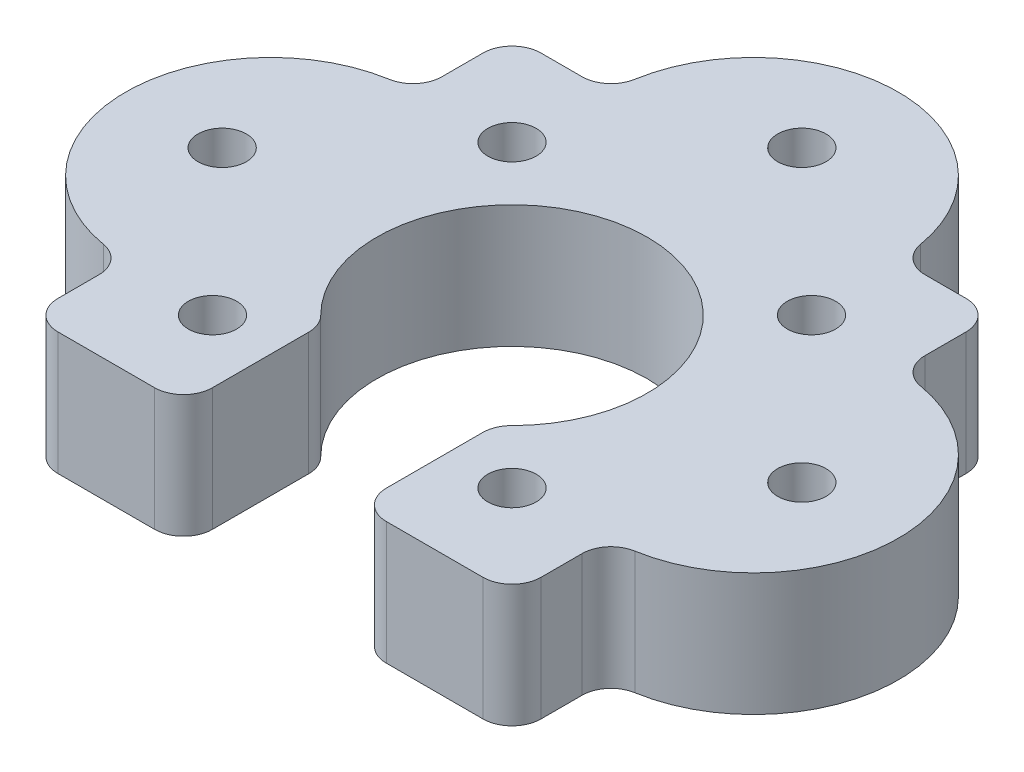
ISO-10303-21;
HEADER;
FILE_DESCRIPTION(('STEP AP214'),'2;1');
FILE_NAME('part.step','',(''),(''),'','','');
FILE_SCHEMA(('AUTOMOTIVE_DESIGN { 1 0 10303 214 1 1 1 1 }'));
ENDSEC;
DATA;
#1=APPLICATION_CONTEXT('core data for automotive mechanical design processes');
#2=APPLICATION_PROTOCOL_DEFINITION('international standard','automotive_design',2000,#1);
#3=PRODUCT_CONTEXT('',#1,'mechanical');
#4=PRODUCT('Part','Part','',(#3));
#5=PRODUCT_RELATED_PRODUCT_CATEGORY('part','',(#4));
#6=PRODUCT_DEFINITION_FORMATION('','',#4);
#7=PRODUCT_DEFINITION_CONTEXT('part definition',#1,'design');
#8=PRODUCT_DEFINITION('design','',#6,#7);
#9=PRODUCT_DEFINITION_SHAPE('','',#8);
#10=(LENGTH_UNIT() NAMED_UNIT(*) SI_UNIT(.MILLI.,.METRE.));
#11=(NAMED_UNIT(*) PLANE_ANGLE_UNIT() SI_UNIT($,.RADIAN.));
#12=(NAMED_UNIT(*) SI_UNIT($,.STERADIAN.) SOLID_ANGLE_UNIT());
#13=UNCERTAINTY_MEASURE_WITH_UNIT(LENGTH_MEASURE(1.E-05),#10,'distance_accuracy_value','');
#14=(GEOMETRIC_REPRESENTATION_CONTEXT(3) GLOBAL_UNCERTAINTY_ASSIGNED_CONTEXT((#13)) GLOBAL_UNIT_ASSIGNED_CONTEXT((#10,
#11,#12)) REPRESENTATION_CONTEXT('',''));
#15=CARTESIAN_POINT('',(0.,0.,0.));
#16=DIRECTION('',(0.,0.,1.));
#17=DIRECTION('',(1.,0.,0.));
#18=AXIS2_PLACEMENT_3D('',#15,#16,#17);
#19=CARTESIAN_POINT('',(-25.,-12.7,0.));
#20=DIRECTION('',(0.,1.,0.));
#21=DIRECTION('',(0.,0.,1.));
#22=AXIS2_PLACEMENT_3D('',#19,#20,#21);
#23=CYLINDRICAL_SURFACE('',#22,15.);
#24=CARTESIAN_POINT('',(-25.,-12.7,0.));
#25=DIRECTION('',(0.,1.,0.));
#26=DIRECTION('',(0.,0.,1.));
#27=AXIS2_PLACEMENT_3D('',#24,#25,#26);
#28=CIRCLE('',#27,15.);
#29=CARTESIAN_POINT('',(-27.5,-12.7,-14.790199457749));
#30=VERTEX_POINT('',#29);
#31=CARTESIAN_POINT('',(-27.5,-12.7,14.790199457749));
#32=VERTEX_POINT('',#31);
#33=EDGE_CURVE('E390',#30,#32,#28,.T.);
#34=ORIENTED_EDGE('',*,*,#33,.T.);
#35=DIRECTION('',(0.,1.,0.));
#36=VECTOR('',#35,1.);
#37=CARTESIAN_POINT('',(-27.5,-12.7,14.790199457749));
#38=LINE('',#37,#36);
#39=CARTESIAN_POINT('',(-27.5,0.,14.790199457749));
#40=VERTEX_POINT('',#39);
#41=EDGE_CURVE('E622',#32,#40,#38,.T.);
#42=ORIENTED_EDGE('',*,*,#41,.T.);
#43=CARTESIAN_POINT('',(-25.,0.,0.));
#44=DIRECTION('',(0.,1.,0.));
#45=DIRECTION('',(0.,0.,1.));
#46=AXIS2_PLACEMENT_3D('',#43,#44,#45);
#47=CIRCLE('',#46,15.);
#48=CARTESIAN_POINT('',(-27.5,0.,-14.790199457749));
#49=VERTEX_POINT('',#48);
#50=EDGE_CURVE('E391',#49,#40,#47,.T.);
#51=ORIENTED_EDGE('',*,*,#50,.F.);
#52=DIRECTION('',(0.,1.,0.));
#53=VECTOR('',#52,1.);
#54=CARTESIAN_POINT('',(-27.5,-12.7,-14.790199457749));
#55=LINE('',#54,#53);
#56=EDGE_CURVE('E620',#49,#30,#55,.F.);
#57=ORIENTED_EDGE('',*,*,#56,.T.);
#58=EDGE_LOOP('',(#34,#42,#51,#57));
#59=FACE_BOUND('',#58,.T.);
#60=ADVANCED_FACE('F43',(#59),#23,.T.);
#61=CARTESIAN_POINT('',(-25.,-12.7,0.));
#62=DIRECTION('',(-1.,0.,0.));
#63=DIRECTION('',(0.,0.,1.));
#64=AXIS2_PLACEMENT_3D('',#61,#62,#63);
#65=PLANE('',#64);
#66=DIRECTION('',(0.,0.,1.));
#67=VECTOR('',#66,1.);
#68=CARTESIAN_POINT('',(-25.,-12.7,0.));
#69=LINE('',#68,#67);
#70=CARTESIAN_POINT('',(-25.,-12.7,-22.));
#71=VERTEX_POINT('',#70);
#72=CARTESIAN_POINT('',(-25.,-12.7,-17.7482393492988));
#73=VERTEX_POINT('',#72);
#74=EDGE_CURVE('E257',#71,#73,#69,.T.);
#75=ORIENTED_EDGE('',*,*,#74,.T.);
#76=DIRECTION('',(0.,-1.,0.));
#77=VECTOR('',#76,1.);
#78=CARTESIAN_POINT('',(-25.,0.,-17.7482393492988));
#79=LINE('',#78,#77);
#80=CARTESIAN_POINT('',(-25.,0.,-17.7482393492988));
#81=VERTEX_POINT('',#80);
#82=EDGE_CURVE('E631',#73,#81,#79,.F.);
#83=ORIENTED_EDGE('',*,*,#82,.T.);
#84=DIRECTION('',(0.,0.,1.));
#85=VECTOR('',#84,1.);
#86=CARTESIAN_POINT('',(-25.,0.,0.));
#87=LINE('',#86,#85);
#88=CARTESIAN_POINT('',(-25.,0.,-22.));
#89=VERTEX_POINT('',#88);
#90=EDGE_CURVE('E385',#89,#81,#87,.T.);
#91=ORIENTED_EDGE('',*,*,#90,.F.);
#92=DIRECTION('',(0.,1.,0.));
#93=VECTOR('',#92,1.);
#94=CARTESIAN_POINT('',(-25.,-12.7,-22.));
#95=LINE('',#94,#93);
#96=EDGE_CURVE('E629',#89,#71,#95,.F.);
#97=ORIENTED_EDGE('',*,*,#96,.T.);
#98=EDGE_LOOP('',(#75,#83,#91,#97));
#99=FACE_BOUND('',#98,.T.);
#100=ADVANCED_FACE('F517',(#99),#65,.T.);
#101=CARTESIAN_POINT('',(0.,-12.7,-25.));
#102=DIRECTION('',(0.,0.,-1.));
#103=DIRECTION('',(-1.,0.,0.));
#104=AXIS2_PLACEMENT_3D('',#101,#102,#103);
#105=PLANE('',#104);
#106=DIRECTION('',(-1.,0.,0.));
#107=VECTOR('',#106,1.);
#108=CARTESIAN_POINT('',(0.,0.,-25.));
#109=LINE('',#108,#107);
#110=CARTESIAN_POINT('',(-17.7482393492989,0.,-25.));
#111=VERTEX_POINT('',#110);
#112=CARTESIAN_POINT('',(-22.,0.,-25.));
#113=VERTEX_POINT('',#112);
#114=EDGE_CURVE('E253',#111,#113,#109,.T.);
#115=ORIENTED_EDGE('',*,*,#114,.F.);
#116=DIRECTION('',(0.,-1.,0.));
#117=VECTOR('',#116,1.);
#118=CARTESIAN_POINT('',(-17.7482393492989,-12.7,-25.));
#119=LINE('',#118,#117);
#120=CARTESIAN_POINT('',(-17.7482393492989,-12.7,-25.));
#121=VERTEX_POINT('',#120);
#122=EDGE_CURVE('E270',#111,#121,#119,.T.);
#123=ORIENTED_EDGE('',*,*,#122,.T.);
#124=DIRECTION('',(-1.,0.,0.));
#125=VECTOR('',#124,1.);
#126=CARTESIAN_POINT('',(0.,-12.7,-25.));
#127=LINE('',#126,#125);
#128=CARTESIAN_POINT('',(-22.,-12.7,-25.));
#129=VERTEX_POINT('',#128);
#130=EDGE_CURVE('E262',#121,#129,#127,.T.);
#131=ORIENTED_EDGE('',*,*,#130,.T.);
#132=DIRECTION('',(0.,1.,0.));
#133=VECTOR('',#132,1.);
#134=CARTESIAN_POINT('',(-22.,-12.7,-25.));
#135=LINE('',#134,#133);
#136=EDGE_CURVE('E259',#129,#113,#135,.T.);
#137=ORIENTED_EDGE('',*,*,#136,.T.);
#138=EDGE_LOOP('',(#115,#123,#131,#137));
#139=FACE_BOUND('',#138,.T.);
#140=ADVANCED_FACE('F523',(#139),#105,.T.);
#141=CARTESIAN_POINT('',(0.,-12.7,-25.));
#142=DIRECTION('',(0.,1.,0.));
#143=DIRECTION('',(0.,0.,1.));
#144=AXIS2_PLACEMENT_3D('',#141,#142,#143);
#145=CYLINDRICAL_SURFACE('',#144,15.);
#146=CARTESIAN_POINT('',(0.,-12.7,-25.));
#147=DIRECTION('',(0.,1.,0.));
#148=DIRECTION('',(0.,0.,1.));
#149=AXIS2_PLACEMENT_3D('',#146,#147,#148);
#150=CIRCLE('',#149,15.);
#151=CARTESIAN_POINT('',(14.790199457749,-12.7,-27.5));
#152=VERTEX_POINT('',#151);
#153=CARTESIAN_POINT('',(-14.790199457749,-12.7,-27.5));
#154=VERTEX_POINT('',#153);
#155=EDGE_CURVE('E398',#152,#154,#150,.T.);
#156=ORIENTED_EDGE('',*,*,#155,.T.);
#157=DIRECTION('',(0.,1.,0.));
#158=VECTOR('',#157,1.);
#159=CARTESIAN_POINT('',(-14.790199457749,-12.7,-27.5));
#160=LINE('',#159,#158);
#161=CARTESIAN_POINT('',(-14.790199457749,0.,-27.5));
#162=VERTEX_POINT('',#161);
#163=EDGE_CURVE('E251',#154,#162,#160,.T.);
#164=ORIENTED_EDGE('',*,*,#163,.T.);
#165=CARTESIAN_POINT('',(0.,0.,-25.));
#166=DIRECTION('',(0.,1.,0.));
#167=DIRECTION('',(0.,0.,1.));
#168=AXIS2_PLACEMENT_3D('',#165,#166,#167);
#169=CIRCLE('',#168,15.);
#170=CARTESIAN_POINT('',(14.790199457749,0.,-27.5));
#171=VERTEX_POINT('',#170);
#172=EDGE_CURVE('E233',#171,#162,#169,.T.);
#173=ORIENTED_EDGE('',*,*,#172,.F.);
#174=DIRECTION('',(0.,1.,0.));
#175=VECTOR('',#174,1.);
#176=CARTESIAN_POINT('',(14.790199457749,-12.7,-27.5));
#177=LINE('',#176,#175);
#178=EDGE_CURVE('E248',#171,#152,#177,.F.);
#179=ORIENTED_EDGE('',*,*,#178,.T.);
#180=EDGE_LOOP('',(#156,#164,#173,#179));
#181=FACE_BOUND('',#180,.T.);
#182=ADVANCED_FACE('F247',(#181),#145,.T.);
#183=CARTESIAN_POINT('',(22.,-12.7,-25.));
#184=VERTEX_POINT('',#183);
#185=CARTESIAN_POINT('',(17.7482393492988,-12.7,-25.));
#186=VERTEX_POINT('',#185);
#187=EDGE_CURVE('E400',#184,#186,#127,.T.);
#188=ORIENTED_EDGE('',*,*,#187,.T.);
#189=DIRECTION('',(0.,-1.,0.));
#190=VECTOR('',#189,1.);
#191=CARTESIAN_POINT('',(17.7482393492988,0.,-25.));
#192=LINE('',#191,#190);
#193=CARTESIAN_POINT('',(17.7482393492988,0.,-25.));
#194=VERTEX_POINT('',#193);
#195=EDGE_CURVE('E274',#186,#194,#192,.F.);
#196=ORIENTED_EDGE('',*,*,#195,.T.);
#197=CARTESIAN_POINT('',(22.,0.,-25.));
#198=VERTEX_POINT('',#197);
#199=EDGE_CURVE('E235',#198,#194,#109,.T.);
#200=ORIENTED_EDGE('',*,*,#199,.F.);
#201=DIRECTION('',(0.,1.,0.));
#202=VECTOR('',#201,1.);
#203=CARTESIAN_POINT('',(22.,-12.7,-25.));
#204=LINE('',#203,#202);
#205=EDGE_CURVE('E272',#198,#184,#204,.F.);
#206=ORIENTED_EDGE('',*,*,#205,.T.);
#207=EDGE_LOOP('',(#188,#196,#200,#206));
#208=FACE_BOUND('',#207,.T.);
#209=ADVANCED_FACE('F676',(#208),#105,.T.);
#210=CARTESIAN_POINT('',(25.,-12.7,0.));
#211=DIRECTION('',(1.,0.,0.));
#212=DIRECTION('',(0.,0.,-1.));
#213=AXIS2_PLACEMENT_3D('',#210,#211,#212);
#214=PLANE('',#213);
#215=DIRECTION('',(0.,0.,-1.));
#216=VECTOR('',#215,1.);
#217=CARTESIAN_POINT('',(25.,0.,0.));
#218=LINE('',#217,#216);
#219=CARTESIAN_POINT('',(25.,0.,-17.7482393492989));
#220=VERTEX_POINT('',#219);
#221=CARTESIAN_POINT('',(25.,0.,-22.));
#222=VERTEX_POINT('',#221);
#223=EDGE_CURVE('E321',#220,#222,#218,.T.);
#224=ORIENTED_EDGE('',*,*,#223,.F.);
#225=DIRECTION('',(0.,-1.,0.));
#226=VECTOR('',#225,1.);
#227=CARTESIAN_POINT('',(25.,-12.7,-17.7482393492989));
#228=LINE('',#227,#226);
#229=CARTESIAN_POINT('',(25.,-12.7,-17.7482393492989));
#230=VERTEX_POINT('',#229);
#231=EDGE_CURVE('E284',#220,#230,#228,.T.);
#232=ORIENTED_EDGE('',*,*,#231,.T.);
#233=DIRECTION('',(0.,0.,-1.));
#234=VECTOR('',#233,1.);
#235=CARTESIAN_POINT('',(25.,-12.7,0.));
#236=LINE('',#235,#234);
#237=CARTESIAN_POINT('',(25.,-12.7,-22.));
#238=VERTEX_POINT('',#237);
#239=EDGE_CURVE('E403',#230,#238,#236,.T.);
#240=ORIENTED_EDGE('',*,*,#239,.T.);
#241=DIRECTION('',(0.,1.,0.));
#242=VECTOR('',#241,1.);
#243=CARTESIAN_POINT('',(25.,-12.7,-22.));
#244=LINE('',#243,#242);
#245=EDGE_CURVE('E281',#238,#222,#244,.T.);
#246=ORIENTED_EDGE('',*,*,#245,.T.);
#247=EDGE_LOOP('',(#224,#232,#240,#246));
#248=FACE_BOUND('',#247,.T.);
#249=ADVANCED_FACE('F684',(#248),#214,.T.);
#250=CARTESIAN_POINT('',(25.,-12.7,0.));
#251=DIRECTION('',(0.,1.,0.));
#252=DIRECTION('',(0.,0.,1.));
#253=AXIS2_PLACEMENT_3D('',#250,#251,#252);
#254=CYLINDRICAL_SURFACE('',#253,15.);
#255=CARTESIAN_POINT('',(25.,-12.7,0.));
#256=DIRECTION('',(0.,1.,0.));
#257=DIRECTION('',(0.,0.,1.));
#258=AXIS2_PLACEMENT_3D('',#255,#256,#257);
#259=CIRCLE('',#258,15.);
#260=CARTESIAN_POINT('',(27.5,-12.7,14.790199457749));
#261=VERTEX_POINT('',#260);
#262=CARTESIAN_POINT('',(27.5,-12.7,-14.7901994577491));
#263=VERTEX_POINT('',#262);
#264=EDGE_CURVE('E404',#261,#263,#259,.T.);
#265=ORIENTED_EDGE('',*,*,#264,.T.);
#266=DIRECTION('',(0.,1.,0.));
#267=VECTOR('',#266,1.);
#268=CARTESIAN_POINT('',(27.5,-12.7,-14.7901994577491));
#269=LINE('',#268,#267);
#270=CARTESIAN_POINT('',(27.5,0.,-14.7901994577491));
#271=VERTEX_POINT('',#270);
#272=EDGE_CURVE('E278',#263,#271,#269,.T.);
#273=ORIENTED_EDGE('',*,*,#272,.T.);
#274=CARTESIAN_POINT('',(25.,0.,0.));
#275=DIRECTION('',(0.,1.,0.));
#276=DIRECTION('',(0.,0.,1.));
#277=AXIS2_PLACEMENT_3D('',#274,#275,#276);
#278=CIRCLE('',#277,15.);
#279=CARTESIAN_POINT('',(27.5,0.,14.790199457749));
#280=VERTEX_POINT('',#279);
#281=EDGE_CURVE('E319',#280,#271,#278,.T.);
#282=ORIENTED_EDGE('',*,*,#281,.F.);
#283=DIRECTION('',(0.,1.,0.));
#284=VECTOR('',#283,1.);
#285=CARTESIAN_POINT('',(27.5,-12.7,14.790199457749));
#286=LINE('',#285,#284);
#287=EDGE_CURVE('E276',#280,#261,#286,.F.);
#288=ORIENTED_EDGE('',*,*,#287,.T.);
#289=EDGE_LOOP('',(#265,#273,#282,#288));
#290=FACE_BOUND('',#289,.T.);
#291=ADVANCED_FACE('F691',(#290),#254,.T.);
#292=CARTESIAN_POINT('',(25.,-12.7,22.));
#293=VERTEX_POINT('',#292);
#294=CARTESIAN_POINT('',(25.,-12.7,17.7482393492988));
#295=VERTEX_POINT('',#294);
#296=EDGE_CURVE('E407',#293,#295,#236,.T.);
#297=ORIENTED_EDGE('',*,*,#296,.T.);
#298=DIRECTION('',(0.,-1.,0.));
#299=VECTOR('',#298,1.);
#300=CARTESIAN_POINT('',(25.,0.,17.7482393492988));
#301=LINE('',#300,#299);
#302=CARTESIAN_POINT('',(25.,0.,17.7482393492988));
#303=VERTEX_POINT('',#302);
#304=EDGE_CURVE('E288',#295,#303,#301,.F.);
#305=ORIENTED_EDGE('',*,*,#304,.T.);
#306=CARTESIAN_POINT('',(25.,0.,22.));
#307=VERTEX_POINT('',#306);
#308=EDGE_CURVE('E315',#307,#303,#218,.T.);
#309=ORIENTED_EDGE('',*,*,#308,.F.);
#310=DIRECTION('',(0.,1.,0.));
#311=VECTOR('',#310,1.);
#312=CARTESIAN_POINT('',(25.,-12.7,22.));
#313=LINE('',#312,#311);
#314=EDGE_CURVE('E286',#307,#293,#313,.F.);
#315=ORIENTED_EDGE('',*,*,#314,.T.);
#316=EDGE_LOOP('',(#297,#305,#309,#315));
#317=FACE_BOUND('',#316,.T.);
#318=ADVANCED_FACE('F697',(#317),#214,.T.);
#319=CARTESIAN_POINT('',(0.,-12.7,25.));
#320=DIRECTION('',(0.,0.,1.));
#321=DIRECTION('',(1.,0.,0.));
#322=AXIS2_PLACEMENT_3D('',#319,#320,#321);
#323=PLANE('',#322);
#324=DIRECTION('',(1.,0.,0.));
#325=VECTOR('',#324,1.);
#326=CARTESIAN_POINT('',(0.,0.,25.));
#327=LINE('',#326,#325);
#328=CARTESIAN_POINT('',(12.,0.,25.));
#329=VERTEX_POINT('',#328);
#330=CARTESIAN_POINT('',(22.,0.,25.));
#331=VERTEX_POINT('',#330);
#332=EDGE_CURVE('E320',#329,#331,#327,.T.);
#333=ORIENTED_EDGE('',*,*,#332,.F.);
#334=DIRECTION('',(0.,1.,0.));
#335=VECTOR('',#334,1.);
#336=CARTESIAN_POINT('',(12.,-12.7,25.));
#337=LINE('',#336,#335);
#338=CARTESIAN_POINT('',(12.,-12.7,25.));
#339=VERTEX_POINT('',#338);
#340=EDGE_CURVE('E613',#329,#339,#337,.F.);
#341=ORIENTED_EDGE('',*,*,#340,.T.);
#342=DIRECTION('',(1.,0.,0.));
#343=VECTOR('',#342,1.);
#344=CARTESIAN_POINT('',(0.,-12.7,25.));
#345=LINE('',#344,#343);
#346=CARTESIAN_POINT('',(22.,-12.7,25.));
#347=VERTEX_POINT('',#346);
#348=EDGE_CURVE('E410',#339,#347,#345,.T.);
#349=ORIENTED_EDGE('',*,*,#348,.T.);
#350=DIRECTION('',(0.,1.,0.));
#351=VECTOR('',#350,1.);
#352=CARTESIAN_POINT('',(22.,-12.7,25.));
#353=LINE('',#352,#351);
#354=EDGE_CURVE('E588',#347,#331,#353,.T.);
#355=ORIENTED_EDGE('',*,*,#354,.T.);
#356=EDGE_LOOP('',(#333,#341,#349,#355));
#357=FACE_BOUND('',#356,.T.);
#358=ADVANCED_FACE('F702',(#357),#323,.T.);
#359=CARTESIAN_POINT('',(8.99999999999999,-12.7,0.));
#360=DIRECTION('',(-1.,0.,0.));
#361=DIRECTION('',(0.,0.,1.));
#362=AXIS2_PLACEMENT_3D('',#359,#360,#361);
#363=PLANE('',#362);
#364=DIRECTION('',(0.,0.,1.));
#365=VECTOR('',#364,1.);
#366=CARTESIAN_POINT('',(8.99999999999999,-12.7,0.));
#367=LINE('',#366,#365);
#368=CARTESIAN_POINT('',(9.,-12.7,12.0415945787923));
#369=VERTEX_POINT('',#368);
#370=CARTESIAN_POINT('',(9.,-12.7,22.));
#371=VERTEX_POINT('',#370);
#372=EDGE_CURVE('E413',#369,#371,#367,.T.);
#373=ORIENTED_EDGE('',*,*,#372,.T.);
#374=DIRECTION('',(0.,1.,0.));
#375=VECTOR('',#374,1.);
#376=CARTESIAN_POINT('',(9.,-12.7,22.));
#377=LINE('',#376,#375);
#378=CARTESIAN_POINT('',(9.,0.,22.));
#379=VERTEX_POINT('',#378);
#380=EDGE_CURVE('E609',#371,#379,#377,.T.);
#381=ORIENTED_EDGE('',*,*,#380,.T.);
#382=DIRECTION('',(0.,0.,1.));
#383=VECTOR('',#382,1.);
#384=CARTESIAN_POINT('',(8.99999999999999,0.,0.));
#385=LINE('',#384,#383);
#386=CARTESIAN_POINT('',(9.,0.,12.0415945787923));
#387=VERTEX_POINT('',#386);
#388=EDGE_CURVE('E360',#387,#379,#385,.T.);
#389=ORIENTED_EDGE('',*,*,#388,.F.);
#390=DIRECTION('',(0.,-1.,0.));
#391=VECTOR('',#390,1.);
#392=CARTESIAN_POINT('',(9.,-12.7,12.0415945787923));
#393=LINE('',#392,#391);
#394=EDGE_CURVE('E607',#387,#369,#393,.T.);
#395=ORIENTED_EDGE('',*,*,#394,.T.);
#396=EDGE_LOOP('',(#373,#381,#389,#395));
#397=FACE_BOUND('',#396,.T.);
#398=ADVANCED_FACE('F709',(#397),#363,.T.);
#399=CARTESIAN_POINT('',(0.,-12.7,0.));
#400=DIRECTION('',(0.,1.,0.));
#401=DIRECTION('',(0.,0.,1.));
#402=AXIS2_PLACEMENT_3D('',#399,#400,#401);
#403=CYLINDRICAL_SURFACE('',#402,14.);
#404=CARTESIAN_POINT('',(0.,-12.7,0.));
#405=DIRECTION('',(0.,1.,0.));
#406=DIRECTION('',(0.,0.,1.));
#407=AXIS2_PLACEMENT_3D('',#404,#405,#406);
#408=CIRCLE('',#407,14.);
#409=CARTESIAN_POINT('',(9.88235294117647,-12.7,9.91660730018189));
#410=VERTEX_POINT('',#409);
#411=CARTESIAN_POINT('',(-9.88235294117647,-12.7,9.91660730018189));
#412=VERTEX_POINT('',#411);
#413=EDGE_CURVE('E416',#410,#412,#408,.T.);
#414=ORIENTED_EDGE('',*,*,#413,.F.);
#415=DIRECTION('',(0.,1.,0.));
#416=VECTOR('',#415,1.);
#417=CARTESIAN_POINT('',(9.88235294117647,-12.7,9.91660730018189));
#418=LINE('',#417,#416);
#419=CARTESIAN_POINT('',(9.88235294117647,0.,9.91660730018189));
#420=VERTEX_POINT('',#419);
#421=EDGE_CURVE('E617',#410,#420,#418,.T.);
#422=ORIENTED_EDGE('',*,*,#421,.T.);
#423=CARTESIAN_POINT('',(0.,0.,0.));
#424=DIRECTION('',(0.,1.,0.));
#425=DIRECTION('',(0.,0.,1.));
#426=AXIS2_PLACEMENT_3D('',#423,#424,#425);
#427=CIRCLE('',#426,14.);
#428=CARTESIAN_POINT('',(-9.88235294117647,0.,9.91660730018189));
#429=VERTEX_POINT('',#428);
#430=EDGE_CURVE('E356',#420,#429,#427,.T.);
#431=ORIENTED_EDGE('',*,*,#430,.T.);
#432=DIRECTION('',(0.,1.,0.));
#433=VECTOR('',#432,1.);
#434=CARTESIAN_POINT('',(-9.88235294117647,-12.7,9.91660730018189));
#435=LINE('',#434,#433);
#436=EDGE_CURVE('E615',#429,#412,#435,.F.);
#437=ORIENTED_EDGE('',*,*,#436,.T.);
#438=EDGE_LOOP('',(#414,#422,#431,#437));
#439=FACE_BOUND('',#438,.T.);
#440=ADVANCED_FACE('F755',(#439),#403,.F.);
#441=CARTESIAN_POINT('',(-8.99999999999999,-12.7,0.));
#442=DIRECTION('',(1.,0.,0.));
#443=DIRECTION('',(0.,0.,-1.));
#444=AXIS2_PLACEMENT_3D('',#441,#442,#443);
#445=PLANE('',#444);
#446=DIRECTION('',(0.,0.,-1.));
#447=VECTOR('',#446,1.);
#448=CARTESIAN_POINT('',(-8.99999999999999,0.,0.));
#449=LINE('',#448,#447);
#450=CARTESIAN_POINT('',(-9.,0.,22.));
#451=VERTEX_POINT('',#450);
#452=CARTESIAN_POINT('',(-9.,0.,12.0415945787923));
#453=VERTEX_POINT('',#452);
#454=EDGE_CURVE('E361',#451,#453,#449,.T.);
#455=ORIENTED_EDGE('',*,*,#454,.F.);
#456=DIRECTION('',(0.,1.,0.));
#457=VECTOR('',#456,1.);
#458=CARTESIAN_POINT('',(-9.,-12.7,22.));
#459=LINE('',#458,#457);
#460=CARTESIAN_POINT('',(-9.,-12.7,22.));
#461=VERTEX_POINT('',#460);
#462=EDGE_CURVE('E595',#451,#461,#459,.F.);
#463=ORIENTED_EDGE('',*,*,#462,.T.);
#464=DIRECTION('',(0.,0.,-1.));
#465=VECTOR('',#464,1.);
#466=CARTESIAN_POINT('',(-8.99999999999999,-12.7,0.));
#467=LINE('',#466,#465);
#468=CARTESIAN_POINT('',(-9.,-12.7,12.0415945787923));
#469=VERTEX_POINT('',#468);
#470=EDGE_CURVE('E419',#461,#469,#467,.T.);
#471=ORIENTED_EDGE('',*,*,#470,.T.);
#472=DIRECTION('',(0.,-1.,0.));
#473=VECTOR('',#472,1.);
#474=CARTESIAN_POINT('',(-9.,0.,12.0415945787923));
#475=LINE('',#474,#473);
#476=EDGE_CURVE('E375',#469,#453,#475,.F.);
#477=ORIENTED_EDGE('',*,*,#476,.T.);
#478=EDGE_LOOP('',(#455,#463,#471,#477));
#479=FACE_BOUND('',#478,.T.);
#480=ADVANCED_FACE('F725',(#479),#445,.T.);
#481=CARTESIAN_POINT('',(0.,-12.7,25.));
#482=DIRECTION('',(0.,0.,1.));
#483=DIRECTION('',(1.,0.,0.));
#484=AXIS2_PLACEMENT_3D('',#481,#482,#483);
#485=PLANE('',#484);
#486=DIRECTION('',(1.,0.,0.));
#487=VECTOR('',#486,1.);
#488=CARTESIAN_POINT('',(0.,-12.7,25.));
#489=LINE('',#488,#487);
#490=CARTESIAN_POINT('',(-22.,-12.7,25.));
#491=VERTEX_POINT('',#490);
#492=CARTESIAN_POINT('',(-12.,-12.7,25.));
#493=VERTEX_POINT('',#492);
#494=EDGE_CURVE('E422',#491,#493,#489,.T.);
#495=ORIENTED_EDGE('',*,*,#494,.T.);
#496=DIRECTION('',(0.,1.,0.));
#497=VECTOR('',#496,1.);
#498=CARTESIAN_POINT('',(-12.,-12.7,25.));
#499=LINE('',#498,#497);
#500=CARTESIAN_POINT('',(-12.,0.,25.));
#501=VERTEX_POINT('',#500);
#502=EDGE_CURVE('E293',#493,#501,#499,.T.);
#503=ORIENTED_EDGE('',*,*,#502,.T.);
#504=DIRECTION('',(1.,0.,0.));
#505=VECTOR('',#504,1.);
#506=CARTESIAN_POINT('',(0.,0.,25.));
#507=LINE('',#506,#505);
#508=CARTESIAN_POINT('',(-22.,0.,25.));
#509=VERTEX_POINT('',#508);
#510=EDGE_CURVE('E381',#509,#501,#507,.T.);
#511=ORIENTED_EDGE('',*,*,#510,.F.);
#512=DIRECTION('',(0.,1.,0.));
#513=VECTOR('',#512,1.);
#514=CARTESIAN_POINT('',(-22.,-12.7,25.));
#515=LINE('',#514,#513);
#516=EDGE_CURVE('E291',#509,#491,#515,.F.);
#517=ORIENTED_EDGE('',*,*,#516,.T.);
#518=EDGE_LOOP('',(#495,#503,#511,#517));
#519=FACE_BOUND('',#518,.T.);
#520=ADVANCED_FACE('F529',(#519),#485,.T.);
#521=CARTESIAN_POINT('',(-25.,0.,17.7482393492988));
#522=VERTEX_POINT('',#521);
#523=CARTESIAN_POINT('',(-25.,0.,22.));
#524=VERTEX_POINT('',#523);
#525=EDGE_CURVE('E384',#522,#524,#87,.T.);
#526=ORIENTED_EDGE('',*,*,#525,.F.);
#527=DIRECTION('',(0.,-1.,0.));
#528=VECTOR('',#527,1.);
#529=CARTESIAN_POINT('',(-25.,-12.7,17.7482393492988));
#530=LINE('',#529,#528);
#531=CARTESIAN_POINT('',(-25.,-12.7,17.7482393492988));
#532=VERTEX_POINT('',#531);
#533=EDGE_CURVE('E65',#522,#532,#530,.T.);
#534=ORIENTED_EDGE('',*,*,#533,.T.);
#535=CARTESIAN_POINT('',(-25.,-12.7,22.));
#536=VERTEX_POINT('',#535);
#537=EDGE_CURVE('E264',#532,#536,#69,.T.);
#538=ORIENTED_EDGE('',*,*,#537,.T.);
#539=DIRECTION('',(0.,1.,0.));
#540=VECTOR('',#539,1.);
#541=CARTESIAN_POINT('',(-25.,-12.7,22.));
#542=LINE('',#541,#540);
#543=EDGE_CURVE('E625',#536,#524,#542,.T.);
#544=ORIENTED_EDGE('',*,*,#543,.T.);
#545=EDGE_LOOP('',(#526,#534,#538,#544));
#546=FACE_BOUND('',#545,.T.);
#547=ADVANCED_FACE('F526',(#546),#65,.T.);
#548=CARTESIAN_POINT('',(0.,-12.7,0.));
#549=DIRECTION('',(0.,1.,0.));
#550=DIRECTION('',(0.,0.,1.));
#551=AXIS2_PLACEMENT_3D('',#548,#549,#550);
#552=PLANE('',#551);
#553=CARTESIAN_POINT('',(-15.5,-12.7,15.5));
#554=DIRECTION('',(0.,1.,0.));
#555=DIRECTION('',(0.,0.,1.));
#556=AXIS2_PLACEMENT_3D('',#553,#554,#555);
#557=CIRCLE('',#556,2.5);
#558=CARTESIAN_POINT('',(-15.5,-12.7,18.));
#559=VERTEX_POINT('',#558);
#560=EDGE_CURVE('E477',#559,#559,#557,.T.);
#561=ORIENTED_EDGE('',*,*,#560,.T.);
#562=EDGE_LOOP('',(#561));
#563=FACE_BOUND('',#562,.T.);
#564=CARTESIAN_POINT('',(-15.5,-12.7,-15.5));
#565=DIRECTION('',(0.,1.,0.));
#566=DIRECTION('',(0.,0.,1.));
#567=AXIS2_PLACEMENT_3D('',#564,#565,#566);
#568=CIRCLE('',#567,2.5);
#569=CARTESIAN_POINT('',(-15.5,-12.7,-13.));
#570=VERTEX_POINT('',#569);
#571=EDGE_CURVE('E467',#570,#570,#568,.T.);
#572=ORIENTED_EDGE('',*,*,#571,.T.);
#573=EDGE_LOOP('',(#572));
#574=FACE_BOUND('',#573,.T.);
#575=CARTESIAN_POINT('',(15.5,-12.7,-15.5));
#576=DIRECTION('',(0.,1.,0.));
#577=DIRECTION('',(0.,0.,1.));
#578=AXIS2_PLACEMENT_3D('',#575,#576,#577);
#579=CIRCLE('',#578,2.5);
#580=CARTESIAN_POINT('',(15.5,-12.7,-13.));
#581=VERTEX_POINT('',#580);
#582=EDGE_CURVE('E459',#581,#581,#579,.T.);
#583=ORIENTED_EDGE('',*,*,#582,.T.);
#584=EDGE_LOOP('',(#583));
#585=FACE_BOUND('',#584,.T.);
#586=CARTESIAN_POINT('',(15.5,-12.7,15.5));
#587=DIRECTION('',(0.,1.,0.));
#588=DIRECTION('',(0.,0.,1.));
#589=AXIS2_PLACEMENT_3D('',#586,#587,#588);
#590=CIRCLE('',#589,2.5);
#591=CARTESIAN_POINT('',(15.5,-12.7,18.));
#592=VERTEX_POINT('',#591);
#593=EDGE_CURVE('E452',#592,#592,#590,.T.);
#594=ORIENTED_EDGE('',*,*,#593,.T.);
#595=EDGE_LOOP('',(#594));
#596=FACE_BOUND('',#595,.T.);
#597=CARTESIAN_POINT('',(-30.,-12.7,0.));
#598=DIRECTION('',(0.,1.,0.));
#599=DIRECTION('',(0.,0.,1.));
#600=AXIS2_PLACEMENT_3D('',#597,#598,#599);
#601=CIRCLE('',#600,2.5);
#602=CARTESIAN_POINT('',(-30.,-12.7,2.5));
#603=VERTEX_POINT('',#602);
#604=EDGE_CURVE('E441',#603,#603,#601,.T.);
#605=ORIENTED_EDGE('',*,*,#604,.T.);
#606=EDGE_LOOP('',(#605));
#607=FACE_BOUND('',#606,.T.);
#608=CARTESIAN_POINT('',(0.,-12.7,-30.));
#609=DIRECTION('',(0.,1.,0.));
#610=DIRECTION('',(0.,0.,1.));
#611=AXIS2_PLACEMENT_3D('',#608,#609,#610);
#612=CIRCLE('',#611,2.5);
#613=CARTESIAN_POINT('',(0.,-12.7,-27.5));
#614=VERTEX_POINT('',#613);
#615=EDGE_CURVE('E433',#614,#614,#612,.T.);
#616=ORIENTED_EDGE('',*,*,#615,.T.);
#617=EDGE_LOOP('',(#616));
#618=FACE_BOUND('',#617,.T.);
#619=CARTESIAN_POINT('',(30.,-12.7,0.));
#620=DIRECTION('',(0.,1.,0.));
#621=DIRECTION('',(0.,0.,1.));
#622=AXIS2_PLACEMENT_3D('',#619,#620,#621);
#623=CIRCLE('',#622,2.5);
#624=CARTESIAN_POINT('',(30.,-12.7,2.49999999999998));
#625=VERTEX_POINT('',#624);
#626=EDGE_CURVE('E397',#625,#625,#623,.T.);
#627=ORIENTED_EDGE('',*,*,#626,.T.);
#628=EDGE_LOOP('',(#627));
#629=FACE_BOUND('',#628,.T.);
#630=ORIENTED_EDGE('',*,*,#470,.F.);
#631=CARTESIAN_POINT('',(-12.,-12.7,22.));
#632=DIRECTION('',(0.,1.,0.));
#633=DIRECTION('',(0.,0.,1.));
#634=AXIS2_PLACEMENT_3D('',#631,#632,#633);
#635=CIRCLE('',#634,3.);
#636=EDGE_CURVE('E605',#461,#493,#635,.F.);
#637=ORIENTED_EDGE('',*,*,#636,.T.);
#638=ORIENTED_EDGE('',*,*,#494,.F.);
#639=CARTESIAN_POINT('',(-22.,-12.7,22.));
#640=DIRECTION('',(0.,1.,0.));
#641=DIRECTION('',(0.,0.,1.));
#642=AXIS2_PLACEMENT_3D('',#639,#640,#641);
#643=CIRCLE('',#642,3.);
#644=EDGE_CURVE('E58',#491,#536,#643,.F.);
#645=ORIENTED_EDGE('',*,*,#644,.T.);
#646=ORIENTED_EDGE('',*,*,#537,.F.);
#647=CARTESIAN_POINT('',(-28.,-12.7,17.7482393492988));
#648=DIRECTION('',(0.,1.,0.));
#649=DIRECTION('',(0.,0.,1.));
#650=AXIS2_PLACEMENT_3D('',#647,#648,#649);
#651=CIRCLE('',#650,3.);
#652=EDGE_CURVE('E652',#532,#32,#651,.T.);
#653=ORIENTED_EDGE('',*,*,#652,.T.);
#654=ORIENTED_EDGE('',*,*,#33,.F.);
#655=CARTESIAN_POINT('',(-28.,-12.7,-17.7482393492988));
#656=DIRECTION('',(0.,1.,0.));
#657=DIRECTION('',(0.,0.,1.));
#658=AXIS2_PLACEMENT_3D('',#655,#656,#657);
#659=CIRCLE('',#658,3.);
#660=EDGE_CURVE('E12',#30,#73,#659,.T.);
#661=ORIENTED_EDGE('',*,*,#660,.T.);
#662=ORIENTED_EDGE('',*,*,#74,.F.);
#663=CARTESIAN_POINT('',(-22.,-12.7,-22.));
#664=DIRECTION('',(0.,1.,0.));
#665=DIRECTION('',(0.,0.,1.));
#666=AXIS2_PLACEMENT_3D('',#663,#664,#665);
#667=CIRCLE('',#666,3.);
#668=EDGE_CURVE('E593',#71,#129,#667,.F.);
#669=ORIENTED_EDGE('',*,*,#668,.T.);
#670=ORIENTED_EDGE('',*,*,#130,.F.);
#671=CARTESIAN_POINT('',(-17.7482393492989,-12.7,-28.));
#672=DIRECTION('',(0.,1.,0.));
#673=DIRECTION('',(0.,0.,1.));
#674=AXIS2_PLACEMENT_3D('',#671,#672,#673);
#675=CIRCLE('',#674,3.);
#676=EDGE_CURVE('E242',#121,#154,#675,.T.);
#677=ORIENTED_EDGE('',*,*,#676,.T.);
#678=ORIENTED_EDGE('',*,*,#155,.F.);
#679=CARTESIAN_POINT('',(17.7482393492988,-12.7,-28.));
#680=DIRECTION('',(0.,1.,0.));
#681=DIRECTION('',(0.,0.,1.));
#682=AXIS2_PLACEMENT_3D('',#679,#680,#681);
#683=CIRCLE('',#682,3.);
#684=EDGE_CURVE('E241',#152,#186,#683,.T.);
#685=ORIENTED_EDGE('',*,*,#684,.T.);
#686=ORIENTED_EDGE('',*,*,#187,.F.);
#687=CARTESIAN_POINT('',(22.,-12.7,-22.));
#688=DIRECTION('',(0.,1.,0.));
#689=DIRECTION('',(0.,0.,1.));
#690=AXIS2_PLACEMENT_3D('',#687,#688,#689);
#691=CIRCLE('',#690,3.);
#692=EDGE_CURVE('E591',#184,#238,#691,.F.);
#693=ORIENTED_EDGE('',*,*,#692,.T.);
#694=ORIENTED_EDGE('',*,*,#239,.F.);
#695=CARTESIAN_POINT('',(28.,-12.7,-17.7482393492989));
#696=DIRECTION('',(0.,1.,0.));
#697=DIRECTION('',(0.,0.,1.));
#698=AXIS2_PLACEMENT_3D('',#695,#696,#697);
#699=CIRCLE('',#698,3.);
#700=EDGE_CURVE('E642',#230,#263,#699,.T.);
#701=ORIENTED_EDGE('',*,*,#700,.T.);
#702=ORIENTED_EDGE('',*,*,#264,.F.);
#703=CARTESIAN_POINT('',(28.,-12.7,17.7482393492988));
#704=DIRECTION('',(0.,1.,0.));
#705=DIRECTION('',(0.,0.,1.));
#706=AXIS2_PLACEMENT_3D('',#703,#704,#705);
#707=CIRCLE('',#706,3.);
#708=EDGE_CURVE('E647',#261,#295,#707,.T.);
#709=ORIENTED_EDGE('',*,*,#708,.T.);
#710=ORIENTED_EDGE('',*,*,#296,.F.);
#711=CARTESIAN_POINT('',(22.,-12.7,22.));
#712=DIRECTION('',(0.,1.,0.));
#713=DIRECTION('',(0.,0.,1.));
#714=AXIS2_PLACEMENT_3D('',#711,#712,#713);
#715=CIRCLE('',#714,3.);
#716=EDGE_CURVE('E586',#293,#347,#715,.F.);
#717=ORIENTED_EDGE('',*,*,#716,.T.);
#718=ORIENTED_EDGE('',*,*,#348,.F.);
#719=CARTESIAN_POINT('',(12.,-12.7,22.));
#720=DIRECTION('',(0.,1.,0.));
#721=DIRECTION('',(0.,0.,1.));
#722=AXIS2_PLACEMENT_3D('',#719,#720,#721);
#723=CIRCLE('',#722,3.);
#724=EDGE_CURVE('E603',#339,#371,#723,.F.);
#725=ORIENTED_EDGE('',*,*,#724,.T.);
#726=ORIENTED_EDGE('',*,*,#372,.F.);
#727=CARTESIAN_POINT('',(12.,-12.7,12.0415945787923));
#728=DIRECTION('',(0.,1.,0.));
#729=DIRECTION('',(0.,0.,1.));
#730=AXIS2_PLACEMENT_3D('',#727,#728,#729);
#731=CIRCLE('',#730,3.);
#732=EDGE_CURVE('E601',#369,#410,#731,.F.);
#733=ORIENTED_EDGE('',*,*,#732,.T.);
#734=ORIENTED_EDGE('',*,*,#413,.T.);
#735=CARTESIAN_POINT('',(-12.,-12.7,12.0415945787923));
#736=DIRECTION('',(0.,1.,0.));
#737=DIRECTION('',(0.,0.,1.));
#738=AXIS2_PLACEMENT_3D('',#735,#736,#737);
#739=CIRCLE('',#738,3.);
#740=EDGE_CURVE('E599',#412,#469,#739,.F.);
#741=ORIENTED_EDGE('',*,*,#740,.T.);
#742=EDGE_LOOP('',(#630,#637,#638,#645,#646,#653,#654,#661,#662,#669,#670,#677,#678,#685,#686,
#693,#694,#701,#702,#709,#710,#717,#718,#725,#726,#733,#734,#741));
#743=FACE_BOUND('',#742,.T.);
#744=ADVANCED_FACE('F490',(#563,#574,#585,#596,#607,#618,#629,#743),#552,.F.);
#745=CARTESIAN_POINT('',(0.,0.,0.));
#746=DIRECTION('',(0.,1.,0.));
#747=DIRECTION('',(0.,0.,1.));
#748=AXIS2_PLACEMENT_3D('',#745,#746,#747);
#749=PLANE('',#748);
#750=CARTESIAN_POINT('',(-15.5,0.,15.5));
#751=DIRECTION('',(0.,1.,0.));
#752=DIRECTION('',(0.,0.,1.));
#753=AXIS2_PLACEMENT_3D('',#750,#751,#752);
#754=CIRCLE('',#753,2.5);
#755=CARTESIAN_POINT('',(-15.5,0.,18.));
#756=VERTEX_POINT('',#755);
#757=EDGE_CURVE('E479',#756,#756,#754,.T.);
#758=ORIENTED_EDGE('',*,*,#757,.F.);
#759=EDGE_LOOP('',(#758));
#760=FACE_BOUND('',#759,.T.);
#761=CARTESIAN_POINT('',(-15.5,0.,-15.5));
#762=DIRECTION('',(0.,1.,0.));
#763=DIRECTION('',(0.,0.,1.));
#764=AXIS2_PLACEMENT_3D('',#761,#762,#763);
#765=CIRCLE('',#764,2.5);
#766=CARTESIAN_POINT('',(-15.5,0.,-13.));
#767=VERTEX_POINT('',#766);
#768=EDGE_CURVE('E472',#767,#767,#765,.T.);
#769=ORIENTED_EDGE('',*,*,#768,.F.);
#770=EDGE_LOOP('',(#769));
#771=FACE_BOUND('',#770,.T.);
#772=CARTESIAN_POINT('',(15.5,0.,-15.5));
#773=DIRECTION('',(0.,1.,0.));
#774=DIRECTION('',(0.,0.,1.));
#775=AXIS2_PLACEMENT_3D('',#772,#773,#774);
#776=CIRCLE('',#775,2.5);
#777=CARTESIAN_POINT('',(15.5,0.,-13.));
#778=VERTEX_POINT('',#777);
#779=EDGE_CURVE('E462',#778,#778,#776,.T.);
#780=ORIENTED_EDGE('',*,*,#779,.F.);
#781=EDGE_LOOP('',(#780));
#782=FACE_BOUND('',#781,.T.);
#783=CARTESIAN_POINT('',(15.5,0.,15.5));
#784=DIRECTION('',(0.,1.,0.));
#785=DIRECTION('',(0.,0.,1.));
#786=AXIS2_PLACEMENT_3D('',#783,#784,#785);
#787=CIRCLE('',#786,2.5);
#788=CARTESIAN_POINT('',(15.5,0.,18.));
#789=VERTEX_POINT('',#788);
#790=EDGE_CURVE('E454',#789,#789,#787,.T.);
#791=ORIENTED_EDGE('',*,*,#790,.F.);
#792=EDGE_LOOP('',(#791));
#793=FACE_BOUND('',#792,.T.);
#794=CARTESIAN_POINT('',(-30.,0.,0.));
#795=DIRECTION('',(0.,1.,0.));
#796=DIRECTION('',(0.,0.,1.));
#797=AXIS2_PLACEMENT_3D('',#794,#795,#796);
#798=CIRCLE('',#797,2.5);
#799=CARTESIAN_POINT('',(-30.,0.,2.5));
#800=VERTEX_POINT('',#799);
#801=EDGE_CURVE('E447',#800,#800,#798,.T.);
#802=ORIENTED_EDGE('',*,*,#801,.F.);
#803=EDGE_LOOP('',(#802));
#804=FACE_BOUND('',#803,.T.);
#805=CARTESIAN_POINT('',(0.,0.,-30.));
#806=DIRECTION('',(0.,1.,0.));
#807=DIRECTION('',(0.,0.,1.));
#808=AXIS2_PLACEMENT_3D('',#805,#806,#807);
#809=CIRCLE('',#808,2.5);
#810=CARTESIAN_POINT('',(0.,0.,-27.5));
#811=VERTEX_POINT('',#810);
#812=EDGE_CURVE('E436',#811,#811,#809,.T.);
#813=ORIENTED_EDGE('',*,*,#812,.F.);
#814=EDGE_LOOP('',(#813));
#815=FACE_BOUND('',#814,.T.);
#816=CARTESIAN_POINT('',(30.,0.,0.));
#817=DIRECTION('',(0.,1.,0.));
#818=DIRECTION('',(0.,0.,1.));
#819=AXIS2_PLACEMENT_3D('',#816,#817,#818);
#820=CIRCLE('',#819,2.5);
#821=CARTESIAN_POINT('',(30.,0.,2.49999999999998));
#822=VERTEX_POINT('',#821);
#823=EDGE_CURVE('E428',#822,#822,#820,.T.);
#824=ORIENTED_EDGE('',*,*,#823,.F.);
#825=EDGE_LOOP('',(#824));
#826=FACE_BOUND('',#825,.T.);
#827=ORIENTED_EDGE('',*,*,#510,.T.);
#828=CARTESIAN_POINT('',(-12.,0.,22.));
#829=DIRECTION('',(0.,1.,0.));
#830=DIRECTION('',(0.,0.,1.));
#831=AXIS2_PLACEMENT_3D('',#828,#829,#830);
#832=CIRCLE('',#831,3.);
#833=EDGE_CURVE('E371',#501,#451,#832,.T.);
#834=ORIENTED_EDGE('',*,*,#833,.T.);
#835=ORIENTED_EDGE('',*,*,#454,.T.);
#836=CARTESIAN_POINT('',(-12.,0.,12.0415945787923));
#837=DIRECTION('',(0.,1.,0.));
#838=DIRECTION('',(0.,0.,1.));
#839=AXIS2_PLACEMENT_3D('',#836,#837,#838);
#840=CIRCLE('',#839,3.);
#841=EDGE_CURVE('E341',#453,#429,#840,.T.);
#842=ORIENTED_EDGE('',*,*,#841,.T.);
#843=ORIENTED_EDGE('',*,*,#430,.F.);
#844=CARTESIAN_POINT('',(12.,0.,12.0415945787923));
#845=DIRECTION('',(0.,1.,0.));
#846=DIRECTION('',(0.,0.,1.));
#847=AXIS2_PLACEMENT_3D('',#844,#845,#846);
#848=CIRCLE('',#847,3.);
#849=EDGE_CURVE('E345',#420,#387,#848,.T.);
#850=ORIENTED_EDGE('',*,*,#849,.T.);
#851=ORIENTED_EDGE('',*,*,#388,.T.);
#852=CARTESIAN_POINT('',(12.,0.,22.));
#853=DIRECTION('',(0.,1.,0.));
#854=DIRECTION('',(0.,0.,1.));
#855=AXIS2_PLACEMENT_3D('',#852,#853,#854);
#856=CIRCLE('',#855,3.);
#857=EDGE_CURVE('E367',#379,#329,#856,.T.);
#858=ORIENTED_EDGE('',*,*,#857,.T.);
#859=ORIENTED_EDGE('',*,*,#332,.T.);
#860=CARTESIAN_POINT('',(22.,0.,22.));
#861=DIRECTION('',(0.,1.,0.));
#862=DIRECTION('',(0.,0.,1.));
#863=AXIS2_PLACEMENT_3D('',#860,#861,#862);
#864=CIRCLE('',#863,3.);
#865=EDGE_CURVE('E299',#331,#307,#864,.T.);
#866=ORIENTED_EDGE('',*,*,#865,.T.);
#867=ORIENTED_EDGE('',*,*,#308,.T.);
#868=CARTESIAN_POINT('',(28.,0.,17.7482393492988));
#869=DIRECTION('',(0.,1.,0.));
#870=DIRECTION('',(0.,0.,1.));
#871=AXIS2_PLACEMENT_3D('',#868,#869,#870);
#872=CIRCLE('',#871,3.);
#873=EDGE_CURVE('E644',#303,#280,#872,.F.);
#874=ORIENTED_EDGE('',*,*,#873,.T.);
#875=ORIENTED_EDGE('',*,*,#281,.T.);
#876=CARTESIAN_POINT('',(28.,0.,-17.7482393492989));
#877=DIRECTION('',(0.,1.,0.));
#878=DIRECTION('',(0.,0.,1.));
#879=AXIS2_PLACEMENT_3D('',#876,#877,#878);
#880=CIRCLE('',#879,3.);
#881=EDGE_CURVE('E639',#271,#220,#880,.F.);
#882=ORIENTED_EDGE('',*,*,#881,.T.);
#883=ORIENTED_EDGE('',*,*,#223,.T.);
#884=CARTESIAN_POINT('',(22.,0.,-22.));
#885=DIRECTION('',(0.,1.,0.));
#886=DIRECTION('',(0.,0.,1.));
#887=AXIS2_PLACEMENT_3D('',#884,#885,#886);
#888=CIRCLE('',#887,3.);
#889=EDGE_CURVE('E303',#222,#198,#888,.T.);
#890=ORIENTED_EDGE('',*,*,#889,.T.);
#891=ORIENTED_EDGE('',*,*,#199,.T.);
#892=CARTESIAN_POINT('',(17.7482393492988,0.,-28.));
#893=DIRECTION('',(0.,1.,0.));
#894=DIRECTION('',(0.,0.,1.));
#895=AXIS2_PLACEMENT_3D('',#892,#893,#894);
#896=CIRCLE('',#895,3.);
#897=EDGE_CURVE('E229',#194,#171,#896,.F.);
#898=ORIENTED_EDGE('',*,*,#897,.T.);
#899=ORIENTED_EDGE('',*,*,#172,.T.);
#900=CARTESIAN_POINT('',(-17.7482393492989,0.,-28.));
#901=DIRECTION('',(0.,1.,0.));
#902=DIRECTION('',(0.,0.,1.));
#903=AXIS2_PLACEMENT_3D('',#900,#901,#902);
#904=CIRCLE('',#903,3.);
#905=EDGE_CURVE('E634',#162,#111,#904,.F.);
#906=ORIENTED_EDGE('',*,*,#905,.T.);
#907=ORIENTED_EDGE('',*,*,#114,.T.);
#908=CARTESIAN_POINT('',(-22.,0.,-22.));
#909=DIRECTION('',(0.,1.,0.));
#910=DIRECTION('',(0.,0.,1.));
#911=AXIS2_PLACEMENT_3D('',#908,#909,#910);
#912=CIRCLE('',#911,3.);
#913=EDGE_CURVE('E337',#113,#89,#912,.T.);
#914=ORIENTED_EDGE('',*,*,#913,.T.);
#915=ORIENTED_EDGE('',*,*,#90,.T.);
#916=CARTESIAN_POINT('',(-28.,0.,-17.7482393492988));
#917=DIRECTION('',(0.,1.,0.));
#918=DIRECTION('',(0.,0.,1.));
#919=AXIS2_PLACEMENT_3D('',#916,#917,#918);
#920=CIRCLE('',#919,3.);
#921=EDGE_CURVE('E51',#81,#49,#920,.F.);
#922=ORIENTED_EDGE('',*,*,#921,.T.);
#923=ORIENTED_EDGE('',*,*,#50,.T.);
#924=CARTESIAN_POINT('',(-28.,0.,17.7482393492988));
#925=DIRECTION('',(0.,1.,0.));
#926=DIRECTION('',(0.,0.,1.));
#927=AXIS2_PLACEMENT_3D('',#924,#925,#926);
#928=CIRCLE('',#927,3.);
#929=EDGE_CURVE('E649',#40,#522,#928,.F.);
#930=ORIENTED_EDGE('',*,*,#929,.T.);
#931=ORIENTED_EDGE('',*,*,#525,.T.);
#932=CARTESIAN_POINT('',(-22.,0.,22.));
#933=DIRECTION('',(0.,1.,0.));
#934=DIRECTION('',(0.,0.,1.));
#935=AXIS2_PLACEMENT_3D('',#932,#933,#934);
#936=CIRCLE('',#935,3.);
#937=EDGE_CURVE('E295',#524,#509,#936,.T.);
#938=ORIENTED_EDGE('',*,*,#937,.T.);
#939=EDGE_LOOP('',(#827,#834,#835,#842,#843,#850,#851,#858,#859,#866,#867,#874,#875,#882,#883,
#890,#891,#898,#899,#906,#907,#914,#915,#922,#923,#930,#931,#938));
#940=FACE_BOUND('',#939,.T.);
#941=ADVANCED_FACE('F232',(#760,#771,#782,#793,#804,#815,#826,#940),#749,.T.);
#942=CARTESIAN_POINT('',(30.,0.,0.));
#943=DIRECTION('',(0.,1.,0.));
#944=DIRECTION('',(0.,0.,1.));
#945=AXIS2_PLACEMENT_3D('',#942,#943,#944);
#946=CYLINDRICAL_SURFACE('',#945,2.5);
#947=ORIENTED_EDGE('',*,*,#626,.F.);
#948=EDGE_LOOP('',(#947));
#949=FACE_BOUND('',#948,.T.);
#950=ORIENTED_EDGE('',*,*,#823,.T.);
#951=EDGE_LOOP('',(#950));
#952=FACE_BOUND('',#951,.T.);
#953=ADVANCED_FACE('F489',(#949,#952),#946,.F.);
#954=CARTESIAN_POINT('',(0.,0.,-30.));
#955=DIRECTION('',(0.,1.,0.));
#956=DIRECTION('',(0.,0.,1.));
#957=AXIS2_PLACEMENT_3D('',#954,#955,#956);
#958=CYLINDRICAL_SURFACE('',#957,2.5);
#959=ORIENTED_EDGE('',*,*,#615,.F.);
#960=EDGE_LOOP('',(#959));
#961=FACE_BOUND('',#960,.T.);
#962=ORIENTED_EDGE('',*,*,#812,.T.);
#963=EDGE_LOOP('',(#962));
#964=FACE_BOUND('',#963,.T.);
#965=ADVANCED_FACE('F505',(#961,#964),#958,.F.);
#966=CARTESIAN_POINT('',(-30.,0.,0.));
#967=DIRECTION('',(0.,1.,0.));
#968=DIRECTION('',(0.,0.,1.));
#969=AXIS2_PLACEMENT_3D('',#966,#967,#968);
#970=CYLINDRICAL_SURFACE('',#969,2.5);
#971=ORIENTED_EDGE('',*,*,#604,.F.);
#972=EDGE_LOOP('',(#971));
#973=FACE_BOUND('',#972,.T.);
#974=ORIENTED_EDGE('',*,*,#801,.T.);
#975=EDGE_LOOP('',(#974));
#976=FACE_BOUND('',#975,.T.);
#977=ADVANCED_FACE('F511',(#973,#976),#970,.F.);
#978=CARTESIAN_POINT('',(15.5,0.,15.5));
#979=DIRECTION('',(0.,1.,0.));
#980=DIRECTION('',(0.,0.,1.));
#981=AXIS2_PLACEMENT_3D('',#978,#979,#980);
#982=CYLINDRICAL_SURFACE('',#981,2.5);
#983=ORIENTED_EDGE('',*,*,#593,.F.);
#984=EDGE_LOOP('',(#983));
#985=FACE_BOUND('',#984,.T.);
#986=ORIENTED_EDGE('',*,*,#790,.T.);
#987=EDGE_LOOP('',(#986));
#988=FACE_BOUND('',#987,.T.);
#989=ADVANCED_FACE('F894',(#985,#988),#982,.F.);
#990=CARTESIAN_POINT('',(15.5,0.,-15.5));
#991=DIRECTION('',(0.,1.,0.));
#992=DIRECTION('',(0.,0.,1.));
#993=AXIS2_PLACEMENT_3D('',#990,#991,#992);
#994=CYLINDRICAL_SURFACE('',#993,2.5);
#995=ORIENTED_EDGE('',*,*,#582,.F.);
#996=EDGE_LOOP('',(#995));
#997=FACE_BOUND('',#996,.T.);
#998=ORIENTED_EDGE('',*,*,#779,.T.);
#999=EDGE_LOOP('',(#998));
#1000=FACE_BOUND('',#999,.T.);
#1001=ADVANCED_FACE('F886',(#997,#1000),#994,.F.);
#1002=CARTESIAN_POINT('',(-15.5,0.,-15.5));
#1003=DIRECTION('',(0.,1.,0.));
#1004=DIRECTION('',(0.,0.,1.));
#1005=AXIS2_PLACEMENT_3D('',#1002,#1003,#1004);
#1006=CYLINDRICAL_SURFACE('',#1005,2.5);
#1007=ORIENTED_EDGE('',*,*,#571,.F.);
#1008=EDGE_LOOP('',(#1007));
#1009=FACE_BOUND('',#1008,.T.);
#1010=ORIENTED_EDGE('',*,*,#768,.T.);
#1011=EDGE_LOOP('',(#1010));
#1012=FACE_BOUND('',#1011,.T.);
#1013=ADVANCED_FACE('F879',(#1009,#1012),#1006,.F.);
#1014=CARTESIAN_POINT('',(-15.5,0.,15.5));
#1015=DIRECTION('',(0.,1.,0.));
#1016=DIRECTION('',(0.,0.,1.));
#1017=AXIS2_PLACEMENT_3D('',#1014,#1015,#1016);
#1018=CYLINDRICAL_SURFACE('',#1017,2.5);
#1019=ORIENTED_EDGE('',*,*,#560,.F.);
#1020=EDGE_LOOP('',(#1019));
#1021=FACE_BOUND('',#1020,.T.);
#1022=ORIENTED_EDGE('',*,*,#757,.T.);
#1023=EDGE_LOOP('',(#1022));
#1024=FACE_BOUND('',#1023,.T.);
#1025=ADVANCED_FACE('F485',(#1021,#1024),#1018,.F.);
#1026=CARTESIAN_POINT('',(-17.7482393492989,-12.7,-28.));
#1027=DIRECTION('',(0.,1.,0.));
#1028=DIRECTION('',(0.,0.,1.));
#1029=AXIS2_PLACEMENT_3D('',#1026,#1027,#1028);
#1030=CYLINDRICAL_SURFACE('',#1029,3.);
#1031=ORIENTED_EDGE('',*,*,#676,.F.);
#1032=ORIENTED_EDGE('',*,*,#122,.F.);
#1033=ORIENTED_EDGE('',*,*,#905,.F.);
#1034=ORIENTED_EDGE('',*,*,#163,.F.);
#1035=EDGE_LOOP('',(#1031,#1032,#1033,#1034));
#1036=FACE_BOUND('',#1035,.T.);
#1037=ADVANCED_FACE('F531',(#1036),#1030,.F.);
#1038=CARTESIAN_POINT('',(17.7482393492988,-12.7,-28.));
#1039=DIRECTION('',(0.,1.,0.));
#1040=DIRECTION('',(0.,0.,1.));
#1041=AXIS2_PLACEMENT_3D('',#1038,#1039,#1040);
#1042=CYLINDRICAL_SURFACE('',#1041,3.);
#1043=ORIENTED_EDGE('',*,*,#684,.F.);
#1044=ORIENTED_EDGE('',*,*,#178,.F.);
#1045=ORIENTED_EDGE('',*,*,#897,.F.);
#1046=ORIENTED_EDGE('',*,*,#195,.F.);
#1047=EDGE_LOOP('',(#1043,#1044,#1045,#1046));
#1048=FACE_BOUND('',#1047,.T.);
#1049=ADVANCED_FACE('F256',(#1048),#1042,.F.);
#1050=CARTESIAN_POINT('',(28.,-12.7,-17.7482393492989));
#1051=DIRECTION('',(0.,1.,0.));
#1052=DIRECTION('',(0.,0.,1.));
#1053=AXIS2_PLACEMENT_3D('',#1050,#1051,#1052);
#1054=CYLINDRICAL_SURFACE('',#1053,3.);
#1055=ORIENTED_EDGE('',*,*,#700,.F.);
#1056=ORIENTED_EDGE('',*,*,#231,.F.);
#1057=ORIENTED_EDGE('',*,*,#881,.F.);
#1058=ORIENTED_EDGE('',*,*,#272,.F.);
#1059=EDGE_LOOP('',(#1055,#1056,#1057,#1058));
#1060=FACE_BOUND('',#1059,.T.);
#1061=ADVANCED_FACE('F537',(#1060),#1054,.F.);
#1062=CARTESIAN_POINT('',(28.,-12.7,17.7482393492988));
#1063=DIRECTION('',(0.,1.,0.));
#1064=DIRECTION('',(0.,0.,1.));
#1065=AXIS2_PLACEMENT_3D('',#1062,#1063,#1064);
#1066=CYLINDRICAL_SURFACE('',#1065,3.);
#1067=ORIENTED_EDGE('',*,*,#708,.F.);
#1068=ORIENTED_EDGE('',*,*,#287,.F.);
#1069=ORIENTED_EDGE('',*,*,#873,.F.);
#1070=ORIENTED_EDGE('',*,*,#304,.F.);
#1071=EDGE_LOOP('',(#1067,#1068,#1069,#1070));
#1072=FACE_BOUND('',#1071,.T.);
#1073=ADVANCED_FACE('F540',(#1072),#1066,.F.);
#1074=CARTESIAN_POINT('',(-12.,-12.7,22.));
#1075=DIRECTION('',(0.,1.,0.));
#1076=DIRECTION('',(0.,0.,1.));
#1077=AXIS2_PLACEMENT_3D('',#1074,#1075,#1076);
#1078=CYLINDRICAL_SURFACE('',#1077,3.);
#1079=ORIENTED_EDGE('',*,*,#636,.F.);
#1080=ORIENTED_EDGE('',*,*,#462,.F.);
#1081=ORIENTED_EDGE('',*,*,#833,.F.);
#1082=ORIENTED_EDGE('',*,*,#502,.F.);
#1083=EDGE_LOOP('',(#1079,#1080,#1081,#1082));
#1084=FACE_BOUND('',#1083,.T.);
#1085=ADVANCED_FACE('F544',(#1084),#1078,.T.);
#1086=CARTESIAN_POINT('',(12.,-12.7,22.));
#1087=DIRECTION('',(0.,1.,0.));
#1088=DIRECTION('',(0.,0.,1.));
#1089=AXIS2_PLACEMENT_3D('',#1086,#1087,#1088);
#1090=CYLINDRICAL_SURFACE('',#1089,3.);
#1091=ORIENTED_EDGE('',*,*,#724,.F.);
#1092=ORIENTED_EDGE('',*,*,#340,.F.);
#1093=ORIENTED_EDGE('',*,*,#857,.F.);
#1094=ORIENTED_EDGE('',*,*,#380,.F.);
#1095=EDGE_LOOP('',(#1091,#1092,#1093,#1094));
#1096=FACE_BOUND('',#1095,.T.);
#1097=ADVANCED_FACE('F548',(#1096),#1090,.T.);
#1098=CARTESIAN_POINT('',(12.,-12.7,12.0415945787923));
#1099=DIRECTION('',(0.,1.,0.));
#1100=DIRECTION('',(0.,0.,1.));
#1101=AXIS2_PLACEMENT_3D('',#1098,#1099,#1100);
#1102=CYLINDRICAL_SURFACE('',#1101,3.);
#1103=ORIENTED_EDGE('',*,*,#732,.F.);
#1104=ORIENTED_EDGE('',*,*,#394,.F.);
#1105=ORIENTED_EDGE('',*,*,#849,.F.);
#1106=ORIENTED_EDGE('',*,*,#421,.F.);
#1107=EDGE_LOOP('',(#1103,#1104,#1105,#1106));
#1108=FACE_BOUND('',#1107,.T.);
#1109=ADVANCED_FACE('F552',(#1108),#1102,.T.);
#1110=CARTESIAN_POINT('',(-12.,-12.7,12.0415945787923));
#1111=DIRECTION('',(0.,1.,0.));
#1112=DIRECTION('',(0.,0.,1.));
#1113=AXIS2_PLACEMENT_3D('',#1110,#1111,#1112);
#1114=CYLINDRICAL_SURFACE('',#1113,3.);
#1115=ORIENTED_EDGE('',*,*,#740,.F.);
#1116=ORIENTED_EDGE('',*,*,#436,.F.);
#1117=ORIENTED_EDGE('',*,*,#841,.F.);
#1118=ORIENTED_EDGE('',*,*,#476,.F.);
#1119=EDGE_LOOP('',(#1115,#1116,#1117,#1118));
#1120=FACE_BOUND('',#1119,.T.);
#1121=ADVANCED_FACE('F556',(#1120),#1114,.T.);
#1122=CARTESIAN_POINT('',(-28.,-12.7,17.7482393492988));
#1123=DIRECTION('',(0.,1.,0.));
#1124=DIRECTION('',(0.,0.,1.));
#1125=AXIS2_PLACEMENT_3D('',#1122,#1123,#1124);
#1126=CYLINDRICAL_SURFACE('',#1125,3.);
#1127=ORIENTED_EDGE('',*,*,#652,.F.);
#1128=ORIENTED_EDGE('',*,*,#533,.F.);
#1129=ORIENTED_EDGE('',*,*,#929,.F.);
#1130=ORIENTED_EDGE('',*,*,#41,.F.);
#1131=EDGE_LOOP('',(#1127,#1128,#1129,#1130));
#1132=FACE_BOUND('',#1131,.T.);
#1133=ADVANCED_FACE('F560',(#1132),#1126,.F.);
#1134=CARTESIAN_POINT('',(-28.,-12.7,-17.7482393492988));
#1135=DIRECTION('',(0.,1.,0.));
#1136=DIRECTION('',(0.,0.,1.));
#1137=AXIS2_PLACEMENT_3D('',#1134,#1135,#1136);
#1138=CYLINDRICAL_SURFACE('',#1137,3.);
#1139=ORIENTED_EDGE('',*,*,#660,.F.);
#1140=ORIENTED_EDGE('',*,*,#56,.F.);
#1141=ORIENTED_EDGE('',*,*,#921,.F.);
#1142=ORIENTED_EDGE('',*,*,#82,.F.);
#1143=EDGE_LOOP('',(#1139,#1140,#1141,#1142));
#1144=FACE_BOUND('',#1143,.T.);
#1145=ADVANCED_FACE('F564',(#1144),#1138,.F.);
#1146=CARTESIAN_POINT('',(-22.,-12.7,-22.));
#1147=DIRECTION('',(0.,1.,0.));
#1148=DIRECTION('',(0.,0.,1.));
#1149=AXIS2_PLACEMENT_3D('',#1146,#1147,#1148);
#1150=CYLINDRICAL_SURFACE('',#1149,3.);
#1151=ORIENTED_EDGE('',*,*,#668,.F.);
#1152=ORIENTED_EDGE('',*,*,#96,.F.);
#1153=ORIENTED_EDGE('',*,*,#913,.F.);
#1154=ORIENTED_EDGE('',*,*,#136,.F.);
#1155=EDGE_LOOP('',(#1151,#1152,#1153,#1154));
#1156=FACE_BOUND('',#1155,.T.);
#1157=ADVANCED_FACE('F568',(#1156),#1150,.T.);
#1158=CARTESIAN_POINT('',(22.,-12.7,-22.));
#1159=DIRECTION('',(0.,1.,0.));
#1160=DIRECTION('',(0.,0.,1.));
#1161=AXIS2_PLACEMENT_3D('',#1158,#1159,#1160);
#1162=CYLINDRICAL_SURFACE('',#1161,3.);
#1163=ORIENTED_EDGE('',*,*,#692,.F.);
#1164=ORIENTED_EDGE('',*,*,#205,.F.);
#1165=ORIENTED_EDGE('',*,*,#889,.F.);
#1166=ORIENTED_EDGE('',*,*,#245,.F.);
#1167=EDGE_LOOP('',(#1163,#1164,#1165,#1166));
#1168=FACE_BOUND('',#1167,.T.);
#1169=ADVANCED_FACE('F572',(#1168),#1162,.T.);
#1170=CARTESIAN_POINT('',(22.,-12.7,22.));
#1171=DIRECTION('',(0.,1.,0.));
#1172=DIRECTION('',(0.,0.,1.));
#1173=AXIS2_PLACEMENT_3D('',#1170,#1171,#1172);
#1174=CYLINDRICAL_SURFACE('',#1173,3.);
#1175=ORIENTED_EDGE('',*,*,#716,.F.);
#1176=ORIENTED_EDGE('',*,*,#314,.F.);
#1177=ORIENTED_EDGE('',*,*,#865,.F.);
#1178=ORIENTED_EDGE('',*,*,#354,.F.);
#1179=EDGE_LOOP('',(#1175,#1176,#1177,#1178));
#1180=FACE_BOUND('',#1179,.T.);
#1181=ADVANCED_FACE('F575',(#1180),#1174,.T.);
#1182=CARTESIAN_POINT('',(-22.,-12.7,22.));
#1183=DIRECTION('',(0.,1.,0.));
#1184=DIRECTION('',(0.,0.,1.));
#1185=AXIS2_PLACEMENT_3D('',#1182,#1183,#1184);
#1186=CYLINDRICAL_SURFACE('',#1185,3.);
#1187=ORIENTED_EDGE('',*,*,#644,.F.);
#1188=ORIENTED_EDGE('',*,*,#516,.F.);
#1189=ORIENTED_EDGE('',*,*,#937,.F.);
#1190=ORIENTED_EDGE('',*,*,#543,.F.);
#1191=EDGE_LOOP('',(#1187,#1188,#1189,#1190));
#1192=FACE_BOUND('',#1191,.T.);
#1193=ADVANCED_FACE('F45',(#1192),#1186,.T.);
#1194=CLOSED_SHELL('',(#60,#100,#140,#182,#209,#249,#291,#318,#358,#398,#440,#480,#520,#547,
#744,#941,#953,#965,#977,#989,#1001,#1013,#1025,#1037,#1049,#1061,#1073,#1085,#1097,#1109,#1121,
#1133,#1145,#1157,#1169,#1181,#1193));
#1195=MANIFOLD_SOLID_BREP('B2',#1194);
#1196=ADVANCED_BREP_SHAPE_REPRESENTATION('',(#18,#1195),#14);
#1197=SHAPE_DEFINITION_REPRESENTATION(#9,#1196);
ENDSEC;
END-ISO-10303-21;
